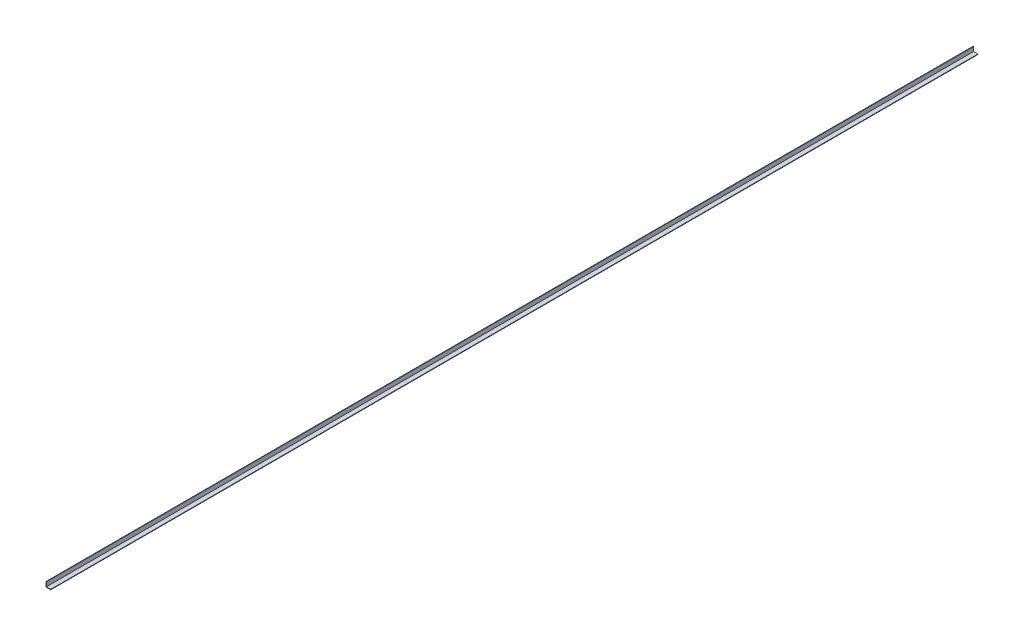
ISO-10303-21;
HEADER;
FILE_DESCRIPTION(('STEP AP214'),'2;1');
FILE_NAME('part.step','',(''),(''),'','','');
FILE_SCHEMA(('AUTOMOTIVE_DESIGN { 1 0 10303 214 1 1 1 1 }'));
ENDSEC;
DATA;
#1=APPLICATION_CONTEXT('core data for automotive mechanical design processes');
#2=APPLICATION_PROTOCOL_DEFINITION('international standard','automotive_design',2000,#1);
#3=PRODUCT_CONTEXT('',#1,'mechanical');
#4=PRODUCT('Part','Part','',(#3));
#5=PRODUCT_RELATED_PRODUCT_CATEGORY('part','',(#4));
#6=PRODUCT_DEFINITION_FORMATION('','',#4);
#7=PRODUCT_DEFINITION_CONTEXT('part definition',#1,'design');
#8=PRODUCT_DEFINITION('design','',#6,#7);
#9=PRODUCT_DEFINITION_SHAPE('','',#8);
#10=(LENGTH_UNIT() NAMED_UNIT(*) SI_UNIT(.MILLI.,.METRE.));
#11=(NAMED_UNIT(*) PLANE_ANGLE_UNIT() SI_UNIT($,.RADIAN.));
#12=(NAMED_UNIT(*) SI_UNIT($,.STERADIAN.) SOLID_ANGLE_UNIT());
#13=UNCERTAINTY_MEASURE_WITH_UNIT(LENGTH_MEASURE(1.E-05),#10,'distance_accuracy_value','');
#14=(GEOMETRIC_REPRESENTATION_CONTEXT(3) GLOBAL_UNCERTAINTY_ASSIGNED_CONTEXT((#13)) GLOBAL_UNIT_ASSIGNED_CONTEXT((#10,
#11,#12)) REPRESENTATION_CONTEXT('',''));
#15=CARTESIAN_POINT('',(0.,0.,0.));
#16=DIRECTION('',(0.,0.,1.));
#17=DIRECTION('',(1.,0.,0.));
#18=AXIS2_PLACEMENT_3D('',#15,#16,#17);
#19=CARTESIAN_POINT('',(3.18,31.75,-6100.));
#20=DIRECTION('',(0.,1.,0.));
#21=DIRECTION('',(0.,0.,1.));
#22=AXIS2_PLACEMENT_3D('',#19,#20,#21);
#23=PLANE('',#22);
#24=DIRECTION('',(-1.,0.,0.));
#25=VECTOR('',#24,1.);
#26=CARTESIAN_POINT('',(3.18,31.75,0.));
#27=LINE('',#26,#25);
#28=CARTESIAN_POINT('',(3.18,31.75,0.));
#29=VERTEX_POINT('',#28);
#30=CARTESIAN_POINT('',(0.,31.75,0.));
#31=VERTEX_POINT('',#30);
#32=EDGE_CURVE('E118',#29,#31,#27,.T.);
#33=ORIENTED_EDGE('',*,*,#32,.F.);
#34=DIRECTION('',(0.,0.,1.));
#35=VECTOR('',#34,1.);
#36=CARTESIAN_POINT('',(3.18,31.75,-6100.));
#37=LINE('',#36,#35);
#38=CARTESIAN_POINT('',(3.18,31.75,-6100.));
#39=VERTEX_POINT('',#38);
#40=EDGE_CURVE('E11',#39,#29,#37,.T.);
#41=ORIENTED_EDGE('',*,*,#40,.F.);
#42=DIRECTION('',(-1.,0.,0.));
#43=VECTOR('',#42,1.);
#44=CARTESIAN_POINT('',(3.18,31.75,-6100.));
#45=LINE('',#44,#43);
#46=CARTESIAN_POINT('',(0.,31.75,-6100.));
#47=VERTEX_POINT('',#46);
#48=EDGE_CURVE('E132',#39,#47,#45,.T.);
#49=ORIENTED_EDGE('',*,*,#48,.T.);
#50=DIRECTION('',(0.,0.,1.));
#51=VECTOR('',#50,1.);
#52=CARTESIAN_POINT('',(0.,31.75,-6100.));
#53=LINE('',#52,#51);
#54=EDGE_CURVE('E36',#47,#31,#53,.T.);
#55=ORIENTED_EDGE('',*,*,#54,.T.);
#56=EDGE_LOOP('',(#33,#41,#49,#55));
#57=FACE_BOUND('',#56,.T.);
#58=ADVANCED_FACE('F33',(#57),#23,.T.);
#59=CARTESIAN_POINT('',(3.18,3.18,-6100.));
#60=DIRECTION('',(1.,0.,0.));
#61=DIRECTION('',(0.,1.,0.));
#62=AXIS2_PLACEMENT_3D('',#59,#60,#61);
#63=PLANE('',#62);
#64=DIRECTION('',(0.,1.,0.));
#65=VECTOR('',#64,1.);
#66=CARTESIAN_POINT('',(3.18,3.18,0.));
#67=LINE('',#66,#65);
#68=CARTESIAN_POINT('',(3.18,3.18,0.));
#69=VERTEX_POINT('',#68);
#70=EDGE_CURVE('E130',#69,#29,#67,.T.);
#71=ORIENTED_EDGE('',*,*,#70,.F.);
#72=DIRECTION('',(0.,0.,1.));
#73=VECTOR('',#72,1.);
#74=CARTESIAN_POINT('',(3.18,3.18,-6100.));
#75=LINE('',#74,#73);
#76=CARTESIAN_POINT('',(3.18,3.18,-6100.));
#77=VERTEX_POINT('',#76);
#78=EDGE_CURVE('E42',#77,#69,#75,.T.);
#79=ORIENTED_EDGE('',*,*,#78,.F.);
#80=DIRECTION('',(0.,1.,0.));
#81=VECTOR('',#80,1.);
#82=CARTESIAN_POINT('',(3.18,3.18,-6100.));
#83=LINE('',#82,#81);
#84=EDGE_CURVE('E108',#77,#39,#83,.T.);
#85=ORIENTED_EDGE('',*,*,#84,.T.);
#86=ORIENTED_EDGE('',*,*,#40,.T.);
#87=EDGE_LOOP('',(#71,#79,#85,#86));
#88=FACE_BOUND('',#87,.T.);
#89=ADVANCED_FACE('F140',(#88),#63,.T.);
#90=CARTESIAN_POINT('',(31.75,3.18,-6100.));
#91=DIRECTION('',(0.,1.,0.));
#92=DIRECTION('',(-1.,0.,0.));
#93=AXIS2_PLACEMENT_3D('',#90,#91,#92);
#94=PLANE('',#93);
#95=DIRECTION('',(-1.,0.,0.));
#96=VECTOR('',#95,1.);
#97=CARTESIAN_POINT('',(31.75,3.18,0.));
#98=LINE('',#97,#96);
#99=CARTESIAN_POINT('',(31.75,3.18,0.));
#100=VERTEX_POINT('',#99);
#101=EDGE_CURVE('E95',#100,#69,#98,.T.);
#102=ORIENTED_EDGE('',*,*,#101,.F.);
#103=DIRECTION('',(0.,0.,1.));
#104=VECTOR('',#103,1.);
#105=CARTESIAN_POINT('',(31.75,3.18,-6100.));
#106=LINE('',#105,#104);
#107=CARTESIAN_POINT('',(31.75,3.18,-6100.));
#108=VERTEX_POINT('',#107);
#109=EDGE_CURVE('E90',#108,#100,#106,.T.);
#110=ORIENTED_EDGE('',*,*,#109,.F.);
#111=DIRECTION('',(-1.,0.,0.));
#112=VECTOR('',#111,1.);
#113=CARTESIAN_POINT('',(31.75,3.18,-6100.));
#114=LINE('',#113,#112);
#115=EDGE_CURVE('E93',#108,#77,#114,.T.);
#116=ORIENTED_EDGE('',*,*,#115,.T.);
#117=ORIENTED_EDGE('',*,*,#78,.T.);
#118=EDGE_LOOP('',(#102,#110,#116,#117));
#119=FACE_BOUND('',#118,.T.);
#120=ADVANCED_FACE('F92',(#119),#94,.T.);
#121=CARTESIAN_POINT('',(31.75,0.,-6100.));
#122=DIRECTION('',(1.,0.,0.));
#123=DIRECTION('',(0.,0.,-1.));
#124=AXIS2_PLACEMENT_3D('',#121,#122,#123);
#125=PLANE('',#124);
#126=DIRECTION('',(0.,1.,0.));
#127=VECTOR('',#126,1.);
#128=CARTESIAN_POINT('',(31.75,0.,0.));
#129=LINE('',#128,#127);
#130=CARTESIAN_POINT('',(31.75,0.,0.));
#131=VERTEX_POINT('',#130);
#132=EDGE_CURVE('E127',#131,#100,#129,.T.);
#133=ORIENTED_EDGE('',*,*,#132,.F.);
#134=DIRECTION('',(0.,0.,1.));
#135=VECTOR('',#134,1.);
#136=CARTESIAN_POINT('',(31.75,0.,-6100.));
#137=LINE('',#136,#135);
#138=CARTESIAN_POINT('',(31.75,0.,-6100.));
#139=VERTEX_POINT('',#138);
#140=EDGE_CURVE('E100',#139,#131,#137,.T.);
#141=ORIENTED_EDGE('',*,*,#140,.F.);
#142=DIRECTION('',(0.,1.,0.));
#143=VECTOR('',#142,1.);
#144=CARTESIAN_POINT('',(31.75,0.,-6100.));
#145=LINE('',#144,#143);
#146=EDGE_CURVE('E106',#139,#108,#145,.T.);
#147=ORIENTED_EDGE('',*,*,#146,.T.);
#148=ORIENTED_EDGE('',*,*,#109,.T.);
#149=EDGE_LOOP('',(#133,#141,#147,#148));
#150=FACE_BOUND('',#149,.T.);
#151=ADVANCED_FACE('F110',(#150),#125,.T.);
#152=CARTESIAN_POINT('',(0.,0.,-6100.));
#153=DIRECTION('',(0.,-1.,0.));
#154=DIRECTION('',(0.,0.,-1.));
#155=AXIS2_PLACEMENT_3D('',#152,#153,#154);
#156=PLANE('',#155);
#157=DIRECTION('',(1.,0.,0.));
#158=VECTOR('',#157,1.);
#159=CARTESIAN_POINT('',(0.,0.,0.));
#160=LINE('',#159,#158);
#161=CARTESIAN_POINT('',(0.,0.,0.));
#162=VERTEX_POINT('',#161);
#163=EDGE_CURVE('E124',#162,#131,#160,.T.);
#164=ORIENTED_EDGE('',*,*,#163,.F.);
#165=DIRECTION('',(0.,0.,1.));
#166=VECTOR('',#165,1.);
#167=CARTESIAN_POINT('',(0.,0.,-6100.));
#168=LINE('',#167,#166);
#169=CARTESIAN_POINT('',(0.,0.,-6100.));
#170=VERTEX_POINT('',#169);
#171=EDGE_CURVE('E135',#170,#162,#168,.T.);
#172=ORIENTED_EDGE('',*,*,#171,.F.);
#173=DIRECTION('',(1.,0.,0.));
#174=VECTOR('',#173,1.);
#175=CARTESIAN_POINT('',(0.,0.,-6100.));
#176=LINE('',#175,#174);
#177=EDGE_CURVE('E111',#170,#139,#176,.T.);
#178=ORIENTED_EDGE('',*,*,#177,.T.);
#179=ORIENTED_EDGE('',*,*,#140,.T.);
#180=EDGE_LOOP('',(#164,#172,#178,#179));
#181=FACE_BOUND('',#180,.T.);
#182=ADVANCED_FACE('F153',(#181),#156,.T.);
#183=CARTESIAN_POINT('',(0.,31.75,-6100.));
#184=DIRECTION('',(-1.,0.,0.));
#185=DIRECTION('',(0.,-1.,0.));
#186=AXIS2_PLACEMENT_3D('',#183,#184,#185);
#187=PLANE('',#186);
#188=DIRECTION('',(0.,-1.,0.));
#189=VECTOR('',#188,1.);
#190=CARTESIAN_POINT('',(0.,31.75,0.));
#191=LINE('',#190,#189);
#192=EDGE_CURVE('E121',#31,#162,#191,.T.);
#193=ORIENTED_EDGE('',*,*,#192,.F.);
#194=ORIENTED_EDGE('',*,*,#54,.F.);
#195=DIRECTION('',(0.,-1.,0.));
#196=VECTOR('',#195,1.);
#197=CARTESIAN_POINT('',(0.,31.75,-6100.));
#198=LINE('',#197,#196);
#199=EDGE_CURVE('E113',#47,#170,#198,.T.);
#200=ORIENTED_EDGE('',*,*,#199,.T.);
#201=ORIENTED_EDGE('',*,*,#171,.T.);
#202=EDGE_LOOP('',(#193,#194,#200,#201));
#203=FACE_BOUND('',#202,.T.);
#204=ADVANCED_FACE('F137',(#203),#187,.T.);
#205=CARTESIAN_POINT('',(0.,0.,-6100.));
#206=DIRECTION('',(0.,0.,1.));
#207=DIRECTION('',(1.,0.,0.));
#208=AXIS2_PLACEMENT_3D('',#205,#206,#207);
#209=PLANE('',#208);
#210=ORIENTED_EDGE('',*,*,#48,.F.);
#211=ORIENTED_EDGE('',*,*,#84,.F.);
#212=ORIENTED_EDGE('',*,*,#115,.F.);
#213=ORIENTED_EDGE('',*,*,#146,.F.);
#214=ORIENTED_EDGE('',*,*,#177,.F.);
#215=ORIENTED_EDGE('',*,*,#199,.F.);
#216=EDGE_LOOP('',(#210,#211,#212,#213,#214,#215));
#217=FACE_BOUND('',#216,.T.);
#218=ADVANCED_FACE('F104',(#217),#209,.F.);
#219=CARTESIAN_POINT('',(0.,0.,0.));
#220=DIRECTION('',(0.,0.,1.));
#221=DIRECTION('',(1.,0.,0.));
#222=AXIS2_PLACEMENT_3D('',#219,#220,#221);
#223=PLANE('',#222);
#224=ORIENTED_EDGE('',*,*,#32,.T.);
#225=ORIENTED_EDGE('',*,*,#192,.T.);
#226=ORIENTED_EDGE('',*,*,#163,.T.);
#227=ORIENTED_EDGE('',*,*,#132,.T.);
#228=ORIENTED_EDGE('',*,*,#101,.T.);
#229=ORIENTED_EDGE('',*,*,#70,.T.);
#230=EDGE_LOOP('',(#224,#225,#226,#227,#228,#229));
#231=FACE_BOUND('',#230,.T.);
#232=ADVANCED_FACE('F139',(#231),#223,.T.);
#233=CLOSED_SHELL('',(#58,#89,#120,#151,#182,#204,#218,#232));
#234=MANIFOLD_SOLID_BREP('B2',#233);
#235=ADVANCED_BREP_SHAPE_REPRESENTATION('',(#18,#234),#14);
#236=SHAPE_DEFINITION_REPRESENTATION(#9,#235);
ENDSEC;
END-ISO-10303-21;
